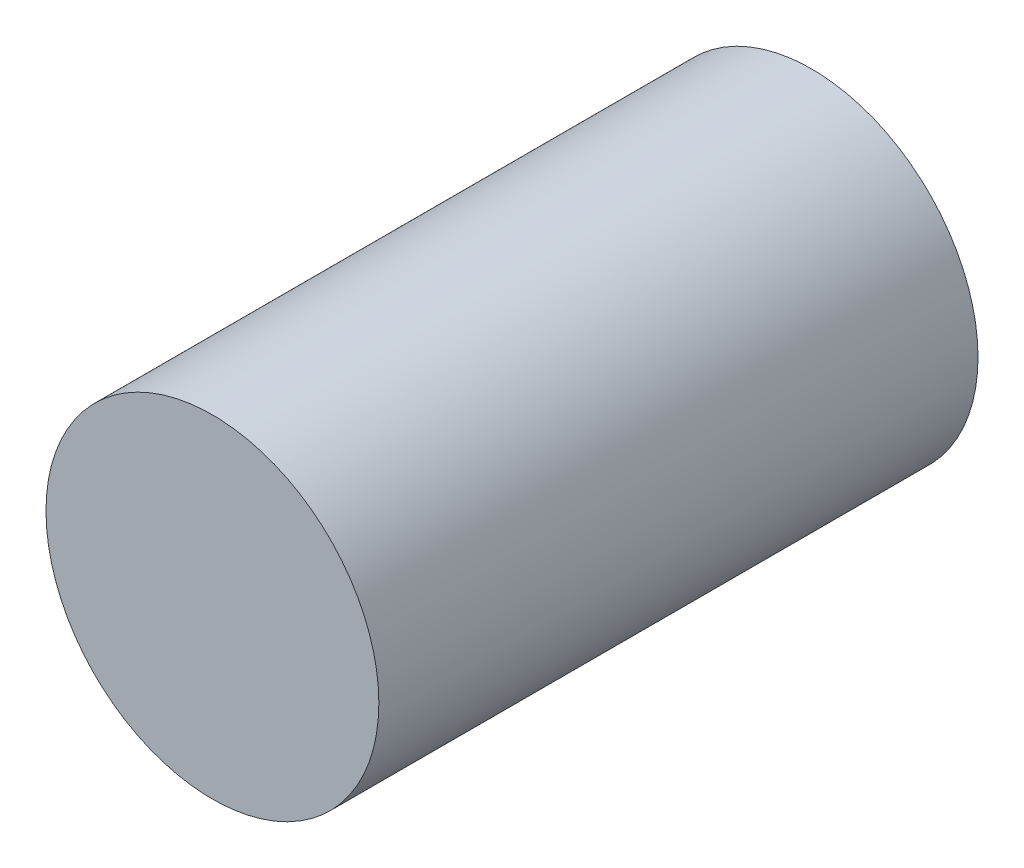
ISO-10303-21;
HEADER;
FILE_DESCRIPTION(('STEP AP214'),'2;1');
FILE_NAME('part.step','',(''),(''),'','','');
FILE_SCHEMA(('AUTOMOTIVE_DESIGN { 1 0 10303 214 1 1 1 1 }'));
ENDSEC;
DATA;
#1=APPLICATION_CONTEXT('core data for automotive mechanical design processes');
#2=APPLICATION_PROTOCOL_DEFINITION('international standard','automotive_design',2000,#1);
#3=PRODUCT_CONTEXT('',#1,'mechanical');
#4=PRODUCT('Part','Part','',(#3));
#5=PRODUCT_RELATED_PRODUCT_CATEGORY('part','',(#4));
#6=PRODUCT_DEFINITION_FORMATION('','',#4);
#7=PRODUCT_DEFINITION_CONTEXT('part definition',#1,'design');
#8=PRODUCT_DEFINITION('design','',#6,#7);
#9=PRODUCT_DEFINITION_SHAPE('','',#8);
#10=(LENGTH_UNIT() NAMED_UNIT(*) SI_UNIT(.MILLI.,.METRE.));
#11=(NAMED_UNIT(*) PLANE_ANGLE_UNIT() SI_UNIT($,.RADIAN.));
#12=(NAMED_UNIT(*) SI_UNIT($,.STERADIAN.) SOLID_ANGLE_UNIT());
#13=UNCERTAINTY_MEASURE_WITH_UNIT(LENGTH_MEASURE(1.E-05),#10,'distance_accuracy_value','');
#14=(GEOMETRIC_REPRESENTATION_CONTEXT(3) GLOBAL_UNCERTAINTY_ASSIGNED_CONTEXT((#13)) GLOBAL_UNIT_ASSIGNED_CONTEXT((#10,
#11,#12)) REPRESENTATION_CONTEXT('',''));
#15=CARTESIAN_POINT('',(0.,0.,0.));
#16=DIRECTION('',(0.,0.,1.));
#17=DIRECTION('',(1.,0.,0.));
#18=AXIS2_PLACEMENT_3D('',#15,#16,#17);
#19=CARTESIAN_POINT('',(0.,0.,114.3));
#20=DIRECTION('',(0.,0.,-1.));
#21=DIRECTION('',(-1.,0.,0.));
#22=AXIS2_PLACEMENT_3D('',#19,#20,#21);
#23=CYLINDRICAL_SURFACE('',#22,63.5);
#24=CARTESIAN_POINT('',(0.,0.,114.3));
#25=DIRECTION('',(0.,0.,1.));
#26=DIRECTION('',(1.,0.,0.));
#27=AXIS2_PLACEMENT_3D('',#24,#25,#26);
#28=CIRCLE('',#27,63.5);
#29=CARTESIAN_POINT('',(63.5,0.,114.3));
#30=VERTEX_POINT('',#29);
#31=EDGE_CURVE('E10',#30,#30,#28,.T.);
#32=ORIENTED_EDGE('',*,*,#31,.F.);
#33=EDGE_LOOP('',(#32));
#34=FACE_BOUND('',#33,.T.);
#35=CARTESIAN_POINT('',(0.,0.,-114.3));
#36=DIRECTION('',(0.,0.,1.));
#37=DIRECTION('',(1.,0.,0.));
#38=AXIS2_PLACEMENT_3D('',#35,#36,#37);
#39=CIRCLE('',#38,63.5);
#40=CARTESIAN_POINT('',(63.5,0.,-114.3));
#41=VERTEX_POINT('',#40);
#42=EDGE_CURVE('E38',#41,#41,#39,.T.);
#43=ORIENTED_EDGE('',*,*,#42,.T.);
#44=EDGE_LOOP('',(#43));
#45=FACE_BOUND('',#44,.T.);
#46=ADVANCED_FACE('F35',(#34,#45),#23,.T.);
#47=CARTESIAN_POINT('',(0.,0.,114.3));
#48=DIRECTION('',(0.,0.,1.));
#49=DIRECTION('',(1.,0.,0.));
#50=AXIS2_PLACEMENT_3D('',#47,#48,#49);
#51=PLANE('',#50);
#52=ORIENTED_EDGE('',*,*,#31,.T.);
#53=EDGE_LOOP('',(#52));
#54=FACE_BOUND('',#53,.T.);
#55=ADVANCED_FACE('F50',(#54),#51,.T.);
#56=CARTESIAN_POINT('',(0.,0.,-114.3));
#57=DIRECTION('',(0.,0.,1.));
#58=DIRECTION('',(1.,0.,0.));
#59=AXIS2_PLACEMENT_3D('',#56,#57,#58);
#60=PLANE('',#59);
#61=ORIENTED_EDGE('',*,*,#42,.F.);
#62=EDGE_LOOP('',(#61));
#63=FACE_BOUND('',#62,.T.);
#64=ADVANCED_FACE('F48',(#63),#60,.F.);
#65=CLOSED_SHELL('',(#46,#55,#64));
#66=MANIFOLD_SOLID_BREP('B2',#65);
#67=ADVANCED_BREP_SHAPE_REPRESENTATION('',(#18,#66),#14);
#68=SHAPE_DEFINITION_REPRESENTATION(#9,#67);
ENDSEC;
END-ISO-10303-21;
